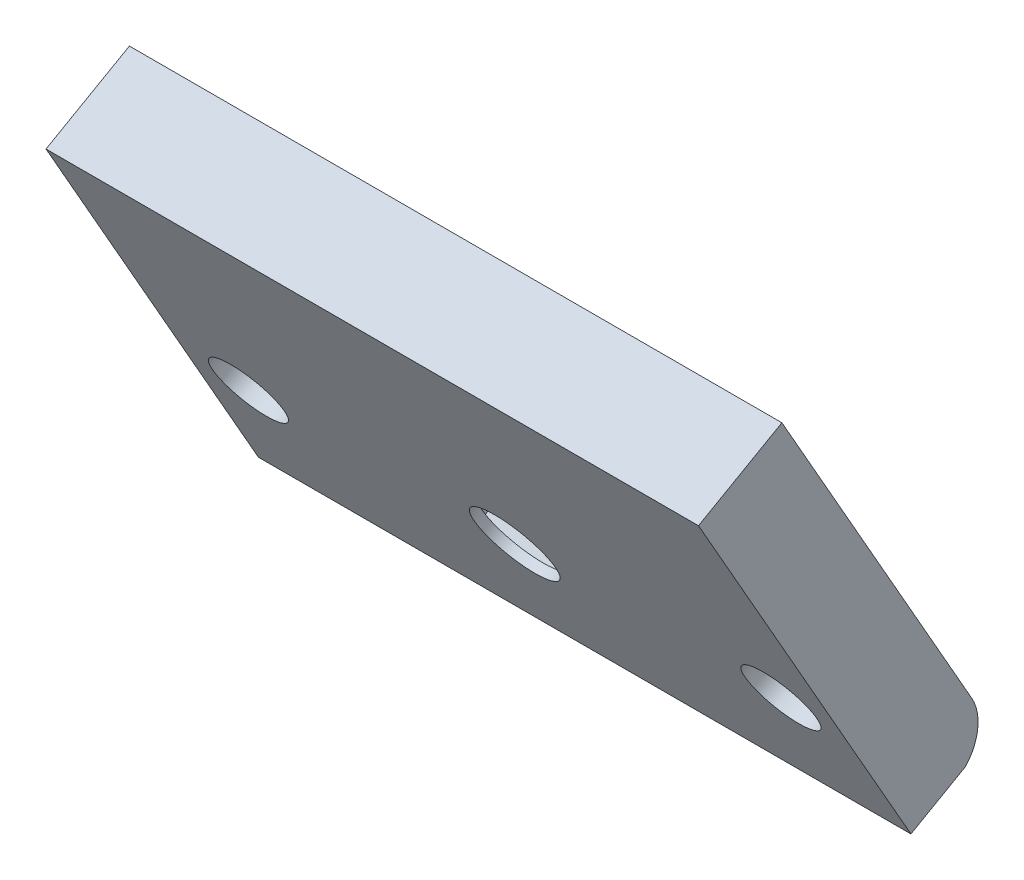
ISO-10303-21;
HEADER;
FILE_DESCRIPTION(('STEP AP214'),'2;1');
FILE_NAME('part.step','',(''),(''),'','','');
FILE_SCHEMA(('AUTOMOTIVE_DESIGN { 1 0 10303 214 1 1 1 1 }'));
ENDSEC;
DATA;
#1=APPLICATION_CONTEXT('core data for automotive mechanical design processes');
#2=APPLICATION_PROTOCOL_DEFINITION('international standard','automotive_design',2000,#1);
#3=PRODUCT_CONTEXT('',#1,'mechanical');
#4=PRODUCT('Part','Part','',(#3));
#5=PRODUCT_RELATED_PRODUCT_CATEGORY('part','',(#4));
#6=PRODUCT_DEFINITION_FORMATION('','',#4);
#7=PRODUCT_DEFINITION_CONTEXT('part definition',#1,'design');
#8=PRODUCT_DEFINITION('design','',#6,#7);
#9=PRODUCT_DEFINITION_SHAPE('','',#8);
#10=(LENGTH_UNIT() NAMED_UNIT(*) SI_UNIT(.MILLI.,.METRE.));
#11=(NAMED_UNIT(*) PLANE_ANGLE_UNIT() SI_UNIT($,.RADIAN.));
#12=(NAMED_UNIT(*) SI_UNIT($,.STERADIAN.) SOLID_ANGLE_UNIT());
#13=UNCERTAINTY_MEASURE_WITH_UNIT(LENGTH_MEASURE(1.E-05),#10,'distance_accuracy_value','');
#14=(GEOMETRIC_REPRESENTATION_CONTEXT(3) GLOBAL_UNCERTAINTY_ASSIGNED_CONTEXT((#13)) GLOBAL_UNIT_ASSIGNED_CONTEXT((#10,
#11,#12)) REPRESENTATION_CONTEXT('',''));
#15=CARTESIAN_POINT('',(0.,0.,0.));
#16=DIRECTION('',(0.,0.,1.));
#17=DIRECTION('',(1.,0.,0.));
#18=AXIS2_PLACEMENT_3D('',#15,#16,#17);
#19=CARTESIAN_POINT('',(-33.9999999999999,129.815203137695,46.6646590965853));
#20=DIRECTION('',(0.,-0.494736971942379,0.869042765687216));
#21=DIRECTION('',(0.,-0.869042765687216,-0.494736971942379));
#22=AXIS2_PLACEMENT_3D('',#19,#20,#21);
#23=PLANE('',#22);
#24=CARTESIAN_POINT('',(0.,57.0490695041152,5.23965904452953));
#25=DIRECTION('',(0.,-0.494736971942379,0.869042765687216));
#26=DIRECTION('',(0.,-0.869042765687216,-0.494736971942379));
#27=AXIS2_PLACEMENT_3D('',#24,#25,#26);
#28=CIRCLE('',#27,4.25);
#29=CARTESIAN_POINT('',(0.,53.3556377499445,3.13702691377442));
#30=VERTEX_POINT('',#29);
#31=EDGE_CURVE('E179',#30,#30,#28,.F.);
#32=ORIENTED_EDGE('',*,*,#31,.F.);
#33=EDGE_LOOP('',(#32));
#34=FACE_BOUND('',#33,.T.);
#35=CARTESIAN_POINT('',(-27.75,57.0490695041152,5.23965904452955));
#36=DIRECTION('',(0.,-0.494736971942379,0.869042765687216));
#37=DIRECTION('',(0.,-0.869042765687216,-0.494736971942379));
#38=AXIS2_PLACEMENT_3D('',#35,#36,#37);
#39=CIRCLE('',#38,3.75000000000001);
#40=CARTESIAN_POINT('',(-27.75,53.7901591327882,3.38439539974563));
#41=VERTEX_POINT('',#40);
#42=EDGE_CURVE('E178',#41,#41,#39,.T.);
#43=ORIENTED_EDGE('',*,*,#42,.T.);
#44=EDGE_LOOP('',(#43));
#45=FACE_BOUND('',#44,.T.);
#46=CARTESIAN_POINT('',(27.75,57.0490695041153,5.23965904452958));
#47=DIRECTION('',(0.,-0.494736971942379,0.869042765687216));
#48=DIRECTION('',(0.,-0.869042765687216,-0.494736971942379));
#49=AXIS2_PLACEMENT_3D('',#46,#47,#48);
#50=CIRCLE('',#49,3.75000000000001);
#51=CARTESIAN_POINT('',(27.75,53.7901591327882,3.38439539974566));
#52=VERTEX_POINT('',#51);
#53=EDGE_CURVE('E174',#52,#52,#50,.T.);
#54=ORIENTED_EDGE('',*,*,#53,.T.);
#55=EDGE_LOOP('',(#54));
#56=FACE_BOUND('',#55,.T.);
#57=CARTESIAN_POINT('',(17.5,48.358641847243,0.292289325105733));
#58=CARTESIAN_POINT('',(17.4972783447475,48.3552968996487,0.290385081368294));
#59=CARTESIAN_POINT('',(17.4945566894576,48.3519519524825,0.288480837874573));
#60=CARTESIAN_POINT('',(17.2482797809468,48.0492765152582,0.116170872006276));
#61=CARTESIAN_POINT('',(17.0046375412352,47.7500030570262,-0.0542023827452684));
#62=CARTESIAN_POINT('',(16.501529448405,47.1610094459144,-0.389510295267227));
#63=CARTESIAN_POINT('',(16.2420552930662,46.871294430298,-0.554442028447173));
#64=CARTESIAN_POINT('',(15.8322203237664,46.4531510742017,-0.792486674810817));
#65=CARTESIAN_POINT('',(15.6925711393815,46.3168500769668,-0.870081409278725));
#66=CARTESIAN_POINT('',(15.4050861749062,46.0509617602916,-1.02144885155031));
#67=CARTESIAN_POINT('',(15.2572527389976,45.9213725387982,-1.09522264217307));
#68=CARTESIAN_POINT('',(14.9527456048189,45.6706985182819,-1.23792874450946));
#69=CARTESIAN_POINT('',(14.7960869769176,45.5495999692563,-1.30686888395606));
#70=CARTESIAN_POINT('',(14.4732920928158,45.3174148596934,-1.43904944234827));
#71=CARTESIAN_POINT('',(14.3071601698682,45.2063237806089,-1.50229243365567));
#72=CARTESIAN_POINT('',(13.9951397677771,45.0142039942232,-1.61166422192607));
#73=CARTESIAN_POINT('',(13.8507717793648,44.9313108204535,-1.65885444018082));
#74=CARTESIAN_POINT('',(13.5557055117445,44.7744796910013,-1.74813676454391));
#75=CARTESIAN_POINT('',(13.4050072086434,44.7005417691234,-1.79022885140762));
#76=CARTESIAN_POINT('',(13.0974326961294,44.562470800823,-1.868831211921));
#77=CARTESIAN_POINT('',(12.9405464270314,44.4983546235233,-1.90533188215524));
#78=CARTESIAN_POINT('',(12.6214595559997,44.3810019766351,-1.97213951862982));
#79=CARTESIAN_POINT('',(12.4592590268308,44.3277653581519,-2.00244656963435));
#80=CARTESIAN_POINT('',(12.129336843026,44.2327309764043,-2.05654865081223));
#81=CARTESIAN_POINT('',(11.9615870317053,44.1910067356895,-2.0803018253657));
#82=CARTESIAN_POINT('',(11.6225676690071,44.1202187450019,-2.12060068929444));
#83=CARTESIAN_POINT('',(11.451298052196,44.0911552306169,-2.13714624455197));
#84=CARTESIAN_POINT('',(11.106681542022,44.0463818353764,-2.16263527093764));
#85=CARTESIAN_POINT('',(10.9333377018539,44.0306543113612,-2.17158878613232));
#86=CARTESIAN_POINT('',(10.5857260212049,44.0130124621464,-2.18163210667377));
#87=CARTESIAN_POINT('',(10.4114582899538,44.0110965389334,-2.1827228217528));
#88=CARTESIAN_POINT('',(10.0713890449694,44.0212064268466,-2.1769673681315));
#89=CARTESIAN_POINT('',(9.9055628061606,44.0326023960148,-2.17047976188101));
#90=CARTESIAN_POINT('',(9.57580640255127,44.0684833885293,-2.15005308751258));
#91=CARTESIAN_POINT('',(9.41187600482867,44.0929667861265,-2.13611494491665));
#92=CARTESIAN_POINT('',(9.08642489886856,44.1552332217919,-2.10066731327983));
#93=CARTESIAN_POINT('',(8.92492271282494,44.193089623232,-2.07911605923733));
#94=CARTESIAN_POINT('',(8.60668414699584,44.2819374466473,-2.0285359211179));
#95=CARTESIAN_POINT('',(8.44995037749486,44.3329359230733,-1.99950302101579));
#96=CARTESIAN_POINT('',(8.29639623176819,44.3904157879339,-1.96678033415663));
#97=B_SPLINE_CURVE_WITH_KNOTS('',3,(#57,#58,#59,#60,#61,#62,#63,#64,#65,#66,#67,#68,#69,#70,#71,
#72,#73,#74,#75,#76,#77,#78,#79,#80,#81,#82,#83,#84,#85,#86,#87,#88,#89,#90,#91,#92,#93,#94,#95,
#96),.UNSPECIFIED.,.F.,.F.,(4,2,2,2,2,2,2,2,2,2,2,2,2,2,2,2,2,2,2,4),(0.,0.0141421356237371,
1.27968723730022,2.54590178874079,3.17565790924472,3.80523457524021,4.43376694260518,
5.06201407910895,5.58072849719426,6.09944487328203,6.61904240458121,7.13863282433377,
7.66146854427636,8.1843139926111,8.70646664631714,9.22855888557431,9.72691642543553,
10.2252120726089,10.7262849084398,11.2276272742767),.UNSPECIFIED.);
#98=CARTESIAN_POINT('',(17.5,48.358641847243,0.2922893251057));
#99=VERTEX_POINT('',#98);
#100=CARTESIAN_POINT('',(12.1130938836837,44.2306887102288,-2.05771129162056));
#101=VERTEX_POINT('',#100);
#102=EDGE_CURVE('E229',#99,#101,#97,.T.);
#103=ORIENTED_EDGE('',*,*,#102,.T.);
#104=DIRECTION('',(-1.,0.,0.));
#105=VECTOR('',#104,1.);
#106=CARTESIAN_POINT('',(-33.9999999999999,44.2306887102287,-2.05771129162057));
#107=LINE('',#106,#105);
#108=CARTESIAN_POINT('',(-12.1130938836837,44.2306887102287,-2.05771129162057));
#109=VERTEX_POINT('',#108);
#110=EDGE_CURVE('E154',#101,#109,#107,.T.);
#111=ORIENTED_EDGE('',*,*,#110,.T.);
#112=CARTESIAN_POINT('',(-17.5,48.358641847243,0.292289325105741));
#113=CARTESIAN_POINT('',(-17.4972783447492,48.3552968996477,0.290385081367716));
#114=CARTESIAN_POINT('',(-17.4945566894609,48.3519519524804,0.28848083787342));
#115=CARTESIAN_POINT('',(-17.2482797811133,48.0492765151861,0.116170871965661));
#116=CARTESIAN_POINT('',(-17.0046375413075,47.7500030570426,-0.0542023827358426));
#117=CARTESIAN_POINT('',(-16.5015294484333,47.1610094460159,-0.389510295209537));
#118=CARTESIAN_POINT('',(-16.2420552931447,46.8712944303962,-0.554442028391253));
#119=CARTESIAN_POINT('',(-15.832220323883,46.4531510743116,-0.792486674748238));
#120=CARTESIAN_POINT('',(-15.6925711395027,46.3168500770816,-0.870081409213301));
#121=CARTESIAN_POINT('',(-15.4050861750407,46.0509617604132,-1.02144885148109));
#122=CARTESIAN_POINT('',(-15.2572527391406,45.9213725389215,-1.09522264210288));
#123=CARTESIAN_POINT('',(-14.9527456049808,45.6706985184096,-1.23792874443674));
#124=CARTESIAN_POINT('',(-14.7960869770901,45.5495999693867,-1.30686888388183));
#125=CARTESIAN_POINT('',(-14.4732920930108,45.3174148598275,-1.43904944227196));
#126=CARTESIAN_POINT('',(-14.3071601700753,45.2063237807439,-1.50229243357878));
#127=CARTESIAN_POINT('',(-13.995139767996,45.0142039943517,-1.61166422185287));
#128=CARTESIAN_POINT('',(-13.8507717795829,44.9313108205755,-1.65885444011138));
#129=CARTESIAN_POINT('',(-13.5557055119598,44.7744796911098,-1.74813676448217));
#130=CARTESIAN_POINT('',(-13.4050072088568,44.700541769225,-1.79022885134981));
#131=CARTESIAN_POINT('',(-13.0974326963416,44.5624708009125,-1.86883121187004));
#132=CARTESIAN_POINT('',(-12.9405464272446,44.4983546236074,-1.90533188210734));
#133=CARTESIAN_POINT('',(-12.6214595562146,44.3810019767084,-1.97213951858808));
#134=CARTESIAN_POINT('',(-12.4592590270465,44.3277653582198,-2.00244656959573));
#135=CARTESIAN_POINT('',(-12.1293368432417,44.2327309764607,-2.05654865078011));
#136=CARTESIAN_POINT('',(-11.9615870319203,44.1910067357401,-2.08030182533692));
#137=CARTESIAN_POINT('',(-11.62256766922,44.1202187450407,-2.12060068927233));
#138=CARTESIAN_POINT('',(-11.4512980524074,44.0911552306499,-2.13714624453317));
#139=CARTESIAN_POINT('',(-11.1066815422282,44.0463818353977,-2.16263527092551));
#140=CARTESIAN_POINT('',(-10.9333377020564,44.0306543113768,-2.17158878612346));
#141=CARTESIAN_POINT('',(-10.5857260213991,44.013012462151,-2.18163210667115));
#142=CARTESIAN_POINT('',(-10.4114582901435,44.0110965389328,-2.18272282175314));
#143=CARTESIAN_POINT('',(-10.0713890451511,44.0212064268364,-2.17696736813729));
#144=CARTESIAN_POINT('',(-9.90556280633862,44.0326023960001,-2.17047976188937));
#145=CARTESIAN_POINT('',(-9.57580640272153,44.0684833885061,-2.15005308752578));
#146=CARTESIAN_POINT('',(-9.41187600499485,44.0929667860993,-2.13611494493214));
#147=CARTESIAN_POINT('',(-9.0864248990283,44.1552332217567,-2.10066731329984));
#148=CARTESIAN_POINT('',(-8.92492271298228,44.1930896231928,-2.07911605925966));
#149=CARTESIAN_POINT('',(-8.60668414714796,44.2819374466001,-2.02853592114474));
#150=CARTESIAN_POINT('',(-8.44995037764417,44.3329359230222,-1.99950302104483));
#151=CARTESIAN_POINT('',(-8.29639623191448,44.3904157878791,-1.96678033418778));
#152=B_SPLINE_CURVE_WITH_KNOTS('',3,(#112,#113,#114,#115,#116,#117,#118,#119,#120,#121,#122,
#123,#124,#125,#126,#127,#128,#129,#130,#131,#132,#133,#134,#135,#136,#137,#138,#139,#140,#141,
#142,#143,#144,#145,#146,#147,#148,#149,#150,#151),.UNSPECIFIED.,.F.,.F.,(4,2,2,2,2,2,2,2,2,2,2,
2,2,2,2,2,2,2,2,4),(0.,0.0141421356237378,1.2796872372145,2.54590178857722,3.1756579090579,
3.80523457503174,4.43376694236693,5.06201407884021,5.58072849694005,6.0994448730447,
6.61904240434918,7.13863282410621,7.66146854405651,8.18431399239926,8.70646664611873,
9.22855888538931,9.72691642526022,10.2252120724433,10.7262849082774,11.2276272741176),.UNSPECIFIED.);
#153=CARTESIAN_POINT('',(-17.5,48.358641847243,0.292289325105752));
#154=VERTEX_POINT('',#153);
#155=EDGE_CURVE('E259',#109,#154,#152,.F.);
#156=ORIENTED_EDGE('',*,*,#155,.T.);
#157=DIRECTION('',(-1.,0.,0.));
#158=VECTOR('',#157,1.);
#159=CARTESIAN_POINT('',(-33.9999999999999,48.358641847243,0.292289325105728));
#160=LINE('',#159,#158);
#161=CARTESIAN_POINT('',(-33.9999999999999,48.358641847243,0.292289325105742));
#162=VERTEX_POINT('',#161);
#163=EDGE_CURVE('E322',#154,#162,#160,.T.);
#164=ORIENTED_EDGE('',*,*,#163,.T.);
#165=DIRECTION('',(0.,-0.869042765687216,-0.494736971942379));
#166=VECTOR('',#165,1.);
#167=CARTESIAN_POINT('',(-33.9999999999999,129.815203137695,46.6646590965853));
#168=LINE('',#167,#166);
#169=CARTESIAN_POINT('',(-33.9999999999999,83.1203524747318,20.081768202801));
#170=VERTEX_POINT('',#169);
#171=EDGE_CURVE('E168',#170,#162,#168,.T.);
#172=ORIENTED_EDGE('',*,*,#171,.F.);
#173=DIRECTION('',(-1.,0.,0.));
#174=VECTOR('',#173,1.);
#175=CARTESIAN_POINT('',(-33.9999999999999,83.1203524747318,20.081768202801));
#176=LINE('',#175,#174);
#177=CARTESIAN_POINT('',(34.,83.1203524747318,20.081768202801));
#178=VERTEX_POINT('',#177);
#179=EDGE_CURVE('E171',#178,#170,#176,.T.);
#180=ORIENTED_EDGE('',*,*,#179,.F.);
#181=DIRECTION('',(0.,-0.869042765687216,-0.494736971942379));
#182=VECTOR('',#181,1.);
#183=CARTESIAN_POINT('',(34.,129.815203137695,46.6646590965853));
#184=LINE('',#183,#182);
#185=CARTESIAN_POINT('',(34.,48.358641847243,0.292289325105742));
#186=VERTEX_POINT('',#185);
#187=EDGE_CURVE('E310',#178,#186,#184,.T.);
#188=ORIENTED_EDGE('',*,*,#187,.T.);
#189=DIRECTION('',(-1.,0.,0.));
#190=VECTOR('',#189,1.);
#191=CARTESIAN_POINT('',(-33.9999999999999,48.358641847243,0.292289325105728));
#192=LINE('',#191,#190);
#193=EDGE_CURVE('E159',#186,#99,#192,.T.);
#194=ORIENTED_EDGE('',*,*,#193,.T.);
#195=EDGE_LOOP('',(#103,#111,#156,#164,#172,#180,#188,#194));
#196=FACE_BOUND('',#195,.T.);
#197=ADVANCED_FACE('F45',(#34,#45,#56,#196),#23,.F.);
#198=CARTESIAN_POINT('',(34.,129.815203137695,46.6646590965853));
#199=DIRECTION('',(-1.,0.,0.));
#200=DIRECTION('',(0.,0.,1.));
#201=AXIS2_PLACEMENT_3D('',#198,#199,#200);
#202=PLANE('',#201);
#203=DIRECTION('',(0.,-0.869042765687216,-0.494736971942379));
#204=VECTOR('',#203,1.);
#205=CARTESIAN_POINT('',(34.,124.867833418271,55.3550867534574));
#206=LINE('',#205,#204);
#207=CARTESIAN_POINT('',(34.,78.172982755308,28.7721958596732));
#208=VERTEX_POINT('',#207);
#209=CARTESIAN_POINT('',(34.,39.283318990805,6.63271636525159));
#210=VERTEX_POINT('',#209);
#211=EDGE_CURVE('E153',#208,#210,#206,.T.);
#212=ORIENTED_EDGE('',*,*,#211,.T.);
#213=DIRECTION('',(0.,0.494736971942379,-0.869042765687216));
#214=VECTOR('',#213,1.);
#215=CARTESIAN_POINT('',(34.,44.2306887102288,-2.05771129162057));
#216=LINE('',#215,#214);
#217=CARTESIAN_POINT('',(34.,42.5294117003954,0.930709953755657));
#218=VERTEX_POINT('',#217);
#219=EDGE_CURVE('E146',#210,#218,#216,.T.);
#220=ORIENTED_EDGE('',*,*,#219,.T.);
#221=CARTESIAN_POINT('',(34.,45.8849569875311,4.63750315354181));
#222=DIRECTION('',(-1.,0.,0.));
#223=DIRECTION('',(0.,0.,1.));
#224=AXIS2_PLACEMENT_3D('',#221,#222,#223);
#225=CIRCLE('',#224,5.);
#226=EDGE_CURVE('E55',#218,#186,#225,.F.);
#227=ORIENTED_EDGE('',*,*,#226,.T.);
#228=ORIENTED_EDGE('',*,*,#187,.F.);
#229=DIRECTION('',(0.,0.49473697194238,-0.869042765687216));
#230=VECTOR('',#229,1.);
#231=CARTESIAN_POINT('',(34.,83.1203524747318,20.081768202801));
#232=LINE('',#231,#230);
#233=EDGE_CURVE('E336',#208,#178,#232,.T.);
#234=ORIENTED_EDGE('',*,*,#233,.F.);
#235=EDGE_LOOP('',(#212,#220,#227,#228,#234));
#236=FACE_BOUND('',#235,.T.);
#237=ADVANCED_FACE('F151',(#236),#202,.F.);
#238=CARTESIAN_POINT('',(-33.9999999999999,124.867833418271,55.3550867534574));
#239=DIRECTION('',(0.,0.494736971942379,-0.869042765687216));
#240=DIRECTION('',(0.,0.869042765687216,0.494736971942379));
#241=AXIS2_PLACEMENT_3D('',#238,#239,#240);
#242=PLANE('',#241);
#243=CARTESIAN_POINT('',(0.,52.1016997846914,13.9300867014017));
#244=DIRECTION('',(0.,0.494736971942379,-0.869042765687216));
#245=DIRECTION('',(0.,0.869042765687216,0.494736971942379));
#246=AXIS2_PLACEMENT_3D('',#243,#244,#245);
#247=CIRCLE('',#246,4.25);
#248=CARTESIAN_POINT('',(0.,48.4082680305207,11.8274545706466));
#249=VERTEX_POINT('',#248);
#250=EDGE_CURVE('E185',#249,#249,#247,.F.);
#251=ORIENTED_EDGE('',*,*,#250,.F.);
#252=EDGE_LOOP('',(#251));
#253=FACE_BOUND('',#252,.T.);
#254=CARTESIAN_POINT('',(-27.75,52.1016997846914,13.9300867014017));
#255=DIRECTION('',(0.,0.494736971942379,-0.869042765687216));
#256=DIRECTION('',(0.,0.869042765687216,0.494736971942379));
#257=AXIS2_PLACEMENT_3D('',#254,#255,#256);
#258=CIRCLE('',#257,3.75000000000001);
#259=CARTESIAN_POINT('',(-27.75,55.3606101560185,15.7853503461856));
#260=VERTEX_POINT('',#259);
#261=EDGE_CURVE('E176',#260,#260,#258,.T.);
#262=ORIENTED_EDGE('',*,*,#261,.T.);
#263=EDGE_LOOP('',(#262));
#264=FACE_BOUND('',#263,.T.);
#265=CARTESIAN_POINT('',(27.75,52.1016997846915,13.9300867014017));
#266=DIRECTION('',(0.,0.494736971942379,-0.869042765687216));
#267=DIRECTION('',(0.,0.869042765687216,0.494736971942379));
#268=AXIS2_PLACEMENT_3D('',#265,#266,#267);
#269=CIRCLE('',#268,3.75000000000001);
#270=CARTESIAN_POINT('',(27.75,55.3606101560185,15.7853503461857));
#271=VERTEX_POINT('',#270);
#272=EDGE_CURVE('E172',#271,#271,#269,.T.);
#273=ORIENTED_EDGE('',*,*,#272,.T.);
#274=EDGE_LOOP('',(#273));
#275=FACE_BOUND('',#274,.T.);
#276=DIRECTION('',(0.,-0.869042765687216,-0.494736971942379));
#277=VECTOR('',#276,1.);
#278=CARTESIAN_POINT('',(-33.9999999999999,124.867833418271,55.3550867534574));
#279=LINE('',#278,#277);
#280=CARTESIAN_POINT('',(-33.9999999999999,78.172982755308,28.7721958596732));
#281=VERTEX_POINT('',#280);
#282=CARTESIAN_POINT('',(-33.9999999999999,39.283318990805,6.63271636525158));
#283=VERTEX_POINT('',#282);
#284=EDGE_CURVE('E314',#281,#283,#279,.T.);
#285=ORIENTED_EDGE('',*,*,#284,.T.);
#286=DIRECTION('',(1.,0.,0.));
#287=VECTOR('',#286,1.);
#288=CARTESIAN_POINT('',(-33.9999999999999,39.283318990805,6.63271636525158));
#289=LINE('',#288,#287);
#290=EDGE_CURVE('E199',#283,#210,#289,.T.);
#291=ORIENTED_EDGE('',*,*,#290,.T.);
#292=ORIENTED_EDGE('',*,*,#211,.F.);
#293=DIRECTION('',(1.,0.,0.));
#294=VECTOR('',#293,1.);
#295=CARTESIAN_POINT('',(-33.9999999999999,78.172982755308,28.7721958596732));
#296=LINE('',#295,#294);
#297=EDGE_CURVE('E334',#281,#208,#296,.T.);
#298=ORIENTED_EDGE('',*,*,#297,.F.);
#299=EDGE_LOOP('',(#285,#291,#292,#298));
#300=FACE_BOUND('',#299,.T.);
#301=ADVANCED_FACE('F282',(#253,#264,#275,#300),#242,.F.);
#302=CARTESIAN_POINT('',(-33.9999999999999,129.815203137695,46.6646590965853));
#303=DIRECTION('',(1.,0.,0.));
#304=DIRECTION('',(0.,0.,-1.));
#305=AXIS2_PLACEMENT_3D('',#302,#303,#304);
#306=PLANE('',#305);
#307=CARTESIAN_POINT('',(-33.9999999999999,45.8849569875311,4.63750315354181));
#308=DIRECTION('',(1.,0.,0.));
#309=DIRECTION('',(0.,0.,-1.));
#310=AXIS2_PLACEMENT_3D('',#307,#308,#309);
#311=CIRCLE('',#310,5.);
#312=CARTESIAN_POINT('',(-33.9999999999999,42.5294117003954,0.930709953755657));
#313=VERTEX_POINT('',#312);
#314=EDGE_CURVE('E161',#162,#313,#311,.F.);
#315=ORIENTED_EDGE('',*,*,#314,.T.);
#316=DIRECTION('',(0.,-0.494736971942379,0.869042765687216));
#317=VECTOR('',#316,1.);
#318=CARTESIAN_POINT('',(-33.9999999999999,44.2306887102288,-2.05771129162056));
#319=LINE('',#318,#317);
#320=EDGE_CURVE('E175',#313,#283,#319,.T.);
#321=ORIENTED_EDGE('',*,*,#320,.T.);
#322=ORIENTED_EDGE('',*,*,#284,.F.);
#323=DIRECTION('',(0.,-0.49473697194238,0.869042765687216));
#324=VECTOR('',#323,1.);
#325=CARTESIAN_POINT('',(-33.9999999999999,83.1203524747318,20.081768202801));
#326=LINE('',#325,#324);
#327=EDGE_CURVE('E330',#170,#281,#326,.T.);
#328=ORIENTED_EDGE('',*,*,#327,.F.);
#329=ORIENTED_EDGE('',*,*,#171,.T.);
#330=EDGE_LOOP('',(#315,#321,#322,#328,#329));
#331=FACE_BOUND('',#330,.T.);
#332=ADVANCED_FACE('F285',(#331),#306,.F.);
#333=CARTESIAN_POINT('',(-17.5,49.595484277099,-1.88031758911231));
#334=DIRECTION('',(0.,0.869042765687216,0.494736971942379));
#335=DIRECTION('',(0.,-0.494736971942379,0.869042765687216));
#336=AXIS2_PLACEMENT_3D('',#333,#334,#335);
#337=TOROIDAL_SURFACE('',#336,7.5,5.);
#338=CARTESIAN_POINT('',(-17.5,45.4675311400847,-4.23031820583861));
#339=DIRECTION('',(0.,-0.869042765687216,-0.494736971942379));
#340=DIRECTION('',(0.,0.494736971942379,-0.869042765687216));
#341=AXIS2_PLACEMENT_3D('',#338,#339,#340);
#342=CIRCLE('',#341,5.93875050040039);
#343=CARTESIAN_POINT('',(-17.5,42.5294117003953,0.930709953755684));
#344=VERTEX_POINT('',#343);
#345=EDGE_CURVE('E197',#344,#109,#342,.F.);
#346=ORIENTED_EDGE('',*,*,#345,.F.);
#347=CARTESIAN_POINT('',(-17.5,45.8849569875311,4.63750315354181));
#348=DIRECTION('',(-1.,0.,0.));
#349=DIRECTION('',(0.,0.,1.));
#350=AXIS2_PLACEMENT_3D('',#347,#348,#349);
#351=CIRCLE('',#350,5.);
#352=EDGE_CURVE('E165',#154,#344,#351,.T.);
#353=ORIENTED_EDGE('',*,*,#352,.F.);
#354=ORIENTED_EDGE('',*,*,#155,.F.);
#355=EDGE_LOOP('',(#346,#353,#354));
#356=FACE_BOUND('',#355,.T.);
#357=ADVANCED_FACE('F289',(#356),#337,.T.);
#358=CARTESIAN_POINT('',(-33.9999999999999,45.8849569875311,4.63750315354181));
#359=DIRECTION('',(-1.,0.,0.));
#360=DIRECTION('',(0.,-1.,0.));
#361=AXIS2_PLACEMENT_3D('',#358,#359,#360);
#362=CYLINDRICAL_SURFACE('',#361,5.);
#363=DIRECTION('',(-1.,0.,0.));
#364=VECTOR('',#363,1.);
#365=CARTESIAN_POINT('',(-33.9999999999999,42.5294117003954,0.930709953755657));
#366=LINE('',#365,#364);
#367=EDGE_CURVE('E201',#313,#344,#366,.F.);
#368=ORIENTED_EDGE('',*,*,#367,.F.);
#369=ORIENTED_EDGE('',*,*,#314,.F.);
#370=ORIENTED_EDGE('',*,*,#163,.F.);
#371=ORIENTED_EDGE('',*,*,#352,.T.);
#372=EDGE_LOOP('',(#368,#369,#370,#371));
#373=FACE_BOUND('',#372,.T.);
#374=ADVANCED_FACE('F291',(#373),#362,.T.);
#375=CARTESIAN_POINT('',(17.5,49.595484277099,-1.88031758911231));
#376=DIRECTION('',(0.,0.869042765687216,0.494736971942379));
#377=DIRECTION('',(0.,-0.494736971942379,0.869042765687216));
#378=AXIS2_PLACEMENT_3D('',#375,#376,#377);
#379=TOROIDAL_SURFACE('',#378,7.5,5.);
#380=CARTESIAN_POINT('',(17.5,45.4675311400847,-4.23031820583861));
#381=DIRECTION('',(0.,-0.869042765687216,-0.494736971942379));
#382=DIRECTION('',(0.,0.494736971942379,-0.869042765687216));
#383=AXIS2_PLACEMENT_3D('',#380,#381,#382);
#384=CIRCLE('',#383,5.93875050040039);
#385=CARTESIAN_POINT('',(17.5,42.5294117003954,0.930709953755661));
#386=VERTEX_POINT('',#385);
#387=EDGE_CURVE('E62',#101,#386,#384,.F.);
#388=ORIENTED_EDGE('',*,*,#387,.F.);
#389=ORIENTED_EDGE('',*,*,#102,.F.);
#390=CARTESIAN_POINT('',(17.5,45.8849569875311,4.63750315354181));
#391=DIRECTION('',(1.,0.,0.));
#392=DIRECTION('',(0.,0.,-1.));
#393=AXIS2_PLACEMENT_3D('',#390,#391,#392);
#394=CIRCLE('',#393,5.);
#395=EDGE_CURVE('E169',#386,#99,#394,.T.);
#396=ORIENTED_EDGE('',*,*,#395,.F.);
#397=EDGE_LOOP('',(#388,#389,#396));
#398=FACE_BOUND('',#397,.T.);
#399=ADVANCED_FACE('F47',(#398),#379,.T.);
#400=CARTESIAN_POINT('',(-33.9999999999999,45.8849569875311,4.63750315354181));
#401=DIRECTION('',(-1.,0.,0.));
#402=DIRECTION('',(0.,-1.,0.));
#403=AXIS2_PLACEMENT_3D('',#400,#401,#402);
#404=CYLINDRICAL_SURFACE('',#403,5.);
#405=DIRECTION('',(-1.,0.,0.));
#406=VECTOR('',#405,1.);
#407=CARTESIAN_POINT('',(-33.9999999999999,42.5294117003954,0.930709953755657));
#408=LINE('',#407,#406);
#409=EDGE_CURVE('E11',#386,#218,#408,.F.);
#410=ORIENTED_EDGE('',*,*,#409,.F.);
#411=ORIENTED_EDGE('',*,*,#395,.T.);
#412=ORIENTED_EDGE('',*,*,#193,.F.);
#413=ORIENTED_EDGE('',*,*,#226,.F.);
#414=EDGE_LOOP('',(#410,#411,#412,#413));
#415=FACE_BOUND('',#414,.T.);
#416=ADVANCED_FACE('F157',(#415),#404,.T.);
#417=CARTESIAN_POINT('',(0.,71.4095344831715,40.6527023213663));
#418=DIRECTION('',(0.,0.869042765687216,0.49473697194238));
#419=DIRECTION('',(0.,-0.49473697194238,0.869042765687216));
#420=AXIS2_PLACEMENT_3D('',#417,#418,#419);
#421=PLANE('',#420);
#422=ORIENTED_EDGE('',*,*,#327,.T.);
#423=ORIENTED_EDGE('',*,*,#297,.T.);
#424=ORIENTED_EDGE('',*,*,#233,.T.);
#425=ORIENTED_EDGE('',*,*,#179,.T.);
#426=EDGE_LOOP('',(#422,#423,#424,#425));
#427=FACE_BOUND('',#426,.T.);
#428=ADVANCED_FACE('F271',(#427),#421,.T.);
#429=CARTESIAN_POINT('',(27.75,70.3681781395573,-18.1563587618393));
#430=DIRECTION('',(0.,-0.494736971942381,0.869042765687215));
#431=DIRECTION('',(0.,-0.869042765687215,-0.494736971942381));
#432=AXIS2_PLACEMENT_3D('',#429,#430,#431);
#433=CYLINDRICAL_SURFACE('',#432,3.75000000000001);
#434=ORIENTED_EDGE('',*,*,#272,.F.);
#435=EDGE_LOOP('',(#434));
#436=FACE_BOUND('',#435,.T.);
#437=ORIENTED_EDGE('',*,*,#53,.F.);
#438=EDGE_LOOP('',(#437));
#439=FACE_BOUND('',#438,.T.);
#440=ADVANCED_FACE('F275',(#436,#439),#433,.F.);
#441=CARTESIAN_POINT('',(-30.,20.2172606914218,40.1236842429856));
#442=DIRECTION('',(0.,0.869042765687216,0.494736971942379));
#443=DIRECTION('',(0.,-0.494736971942379,0.869042765687216));
#444=AXIS2_PLACEMENT_3D('',#441,#442,#443);
#445=PLANE('',#444);
#446=ORIENTED_EDGE('',*,*,#367,.T.);
#447=ORIENTED_EDGE('',*,*,#345,.T.);
#448=ORIENTED_EDGE('',*,*,#110,.F.);
#449=ORIENTED_EDGE('',*,*,#387,.T.);
#450=ORIENTED_EDGE('',*,*,#409,.T.);
#451=ORIENTED_EDGE('',*,*,#219,.F.);
#452=ORIENTED_EDGE('',*,*,#290,.F.);
#453=ORIENTED_EDGE('',*,*,#320,.F.);
#454=EDGE_LOOP('',(#446,#447,#448,#449,#450,#451,#452,#453));
#455=FACE_BOUND('',#454,.T.);
#456=ADVANCED_FACE('F145',(#455),#445,.F.);
#457=CARTESIAN_POINT('',(-27.75,70.3681781395572,-18.1563587618392));
#458=DIRECTION('',(0.,-0.494736971942381,0.869042765687215));
#459=DIRECTION('',(0.,-0.869042765687215,-0.494736971942381));
#460=AXIS2_PLACEMENT_3D('',#457,#458,#459);
#461=CYLINDRICAL_SURFACE('',#460,3.75000000000001);
#462=ORIENTED_EDGE('',*,*,#261,.F.);
#463=EDGE_LOOP('',(#462));
#464=FACE_BOUND('',#463,.T.);
#465=ORIENTED_EDGE('',*,*,#42,.F.);
#466=EDGE_LOOP('',(#465));
#467=FACE_BOUND('',#466,.T.);
#468=ADVANCED_FACE('F413',(#464,#467),#461,.F.);
#469=CARTESIAN_POINT('',(0.,92.0756577668826,-56.2871822120563));
#470=DIRECTION('',(0.,-0.49473697194238,0.869042765687215));
#471=DIRECTION('',(0.,-0.869042765687215,-0.49473697194238));
#472=AXIS2_PLACEMENT_3D('',#469,#470,#471);
#473=CYLINDRICAL_SURFACE('',#472,4.25);
#474=CARTESIAN_POINT('',(0.,56.5543325321728,6.10870181021676));
#475=DIRECTION('',(0.,-0.494736971942379,0.869042765687216));
#476=DIRECTION('',(0.,-0.869042765687216,-0.494736971942379));
#477=AXIS2_PLACEMENT_3D('',#474,#475,#476);
#478=CIRCLE('',#477,4.25);
#479=CARTESIAN_POINT('',(0.,52.8609007780021,4.00606967946166));
#480=VERTEX_POINT('',#479);
#481=EDGE_CURVE('E50',#480,#480,#478,.F.);
#482=CARTESIAN_POINT('',(0.,52.8609007780021,4.00606967946166));
#483=CARTESIAN_POINT('',(0.,52.8660542881265,3.99701715065242));
#484=CARTESIAN_POINT('',(0.,52.8712077982509,3.98796462184318));
#485=CARTESIAN_POINT('',(0.,52.8815148184997,3.96985956422469));
#486=CARTESIAN_POINT('',(0.,52.8866683286241,3.96080703541544));
#487=CARTESIAN_POINT('',(0.,52.8969753488729,3.94270197779696));
#488=CARTESIAN_POINT('',(0.,52.9021288589973,3.93364944898772));
#489=CARTESIAN_POINT('',(0.,52.9124358792461,3.91554439136924));
#490=CARTESIAN_POINT('',(0.,52.9175893893705,3.90649186255999));
#491=CARTESIAN_POINT('',(0.,52.9278964096193,3.88838680494151));
#492=CARTESIAN_POINT('',(0.,52.9330499197437,3.87933427613226));
#493=CARTESIAN_POINT('',(0.,52.9433569399925,3.86122921851378));
#494=CARTESIAN_POINT('',(0.,52.9485104501169,3.85217668970454));
#495=CARTESIAN_POINT('',(0.,52.9588174703657,3.83407163208605));
#496=CARTESIAN_POINT('',(0.,52.9639709804901,3.82501910327681));
#497=CARTESIAN_POINT('',(0.,52.9742780007389,3.80691404565833));
#498=CARTESIAN_POINT('',(0.,52.9794315108633,3.79786151684909));
#499=CARTESIAN_POINT('',(0.,52.9897385311121,3.7797564592306));
#500=CARTESIAN_POINT('',(0.,52.9948920412365,3.77070393042136));
#501=CARTESIAN_POINT('',(0.,53.0051990614853,3.75259887280288));
#502=CARTESIAN_POINT('',(0.,53.0103525716097,3.74354634399364));
#503=CARTESIAN_POINT('',(0.,53.0206595918585,3.72544128637516));
#504=CARTESIAN_POINT('',(0.,53.0258131019829,3.71638875756591));
#505=CARTESIAN_POINT('',(0.,53.0361201222317,3.69828369994743));
#506=CARTESIAN_POINT('',(0.,53.0412736323561,3.68923117113818));
#507=CARTESIAN_POINT('',(0.,53.0515806526049,3.6711261135197));
#508=CARTESIAN_POINT('',(0.,53.0567341627293,3.66207358471046));
#509=CARTESIAN_POINT('',(0.,53.0670411829781,3.64396852709197));
#510=CARTESIAN_POINT('',(0.,53.0721946931025,3.63491599828274));
#511=CARTESIAN_POINT('',(0.,53.0825017133513,3.61681094066425));
#512=CARTESIAN_POINT('',(0.,53.0876552234757,3.607758411855));
#513=CARTESIAN_POINT('',(0.,53.0979622437245,3.58965335423651));
#514=CARTESIAN_POINT('',(0.,53.1031157538489,3.58060082542728));
#515=CARTESIAN_POINT('',(0.,53.1134227740977,3.56249576780879));
#516=CARTESIAN_POINT('',(0.,53.1185762842221,3.55344323899955));
#517=CARTESIAN_POINT('',(0.,53.1288833044709,3.53533818138107));
#518=CARTESIAN_POINT('',(0.,53.1340368145953,3.52628565257182));
#519=CARTESIAN_POINT('',(0.,53.1443438348441,3.50818059495334));
#520=CARTESIAN_POINT('',(0.,53.1494973449685,3.49912806614409));
#521=CARTESIAN_POINT('',(0.,53.1598043652173,3.48102300852561));
#522=CARTESIAN_POINT('',(0.,53.1649578753417,3.47197047971637));
#523=CARTESIAN_POINT('',(0.,53.1752648955905,3.45386542209789));
#524=CARTESIAN_POINT('',(0.,53.1804184057149,3.44481289328865));
#525=CARTESIAN_POINT('',(0.,53.1907254259637,3.42670783567016));
#526=CARTESIAN_POINT('',(0.,53.1958789360881,3.41765530686092));
#527=CARTESIAN_POINT('',(0.,53.2061859563369,3.39955024924243));
#528=CARTESIAN_POINT('',(0.,53.2113394664613,3.3904977204332));
#529=CARTESIAN_POINT('',(0.,53.2216464867101,3.37239266281471));
#530=CARTESIAN_POINT('',(0.,53.2267999968345,3.36334013400546));
#531=CARTESIAN_POINT('',(0.,53.2371070170833,3.34523507638698));
#532=CARTESIAN_POINT('',(0.,53.2422605272077,3.33618254757774));
#533=CARTESIAN_POINT('',(0.,53.2525675474565,3.31807748995926));
#534=CARTESIAN_POINT('',(0.,53.2577210575809,3.30902496115001));
#535=CARTESIAN_POINT('',(0.,53.2680280778297,3.29091990353153));
#536=CARTESIAN_POINT('',(0.,53.2731815879541,3.28186737472229));
#537=CARTESIAN_POINT('',(0.,53.2834886082029,3.26376231710381));
#538=CARTESIAN_POINT('',(0.,53.2886421183273,3.25470978829456));
#539=CARTESIAN_POINT('',(0.,53.2989491385761,3.23660473067607));
#540=CARTESIAN_POINT('',(0.,53.3041026487005,3.22755220186683));
#541=CARTESIAN_POINT('',(0.,53.3144096689493,3.20944714424835));
#542=CARTESIAN_POINT('',(0.,53.3195631790737,3.20039461543911));
#543=CARTESIAN_POINT('',(0.,53.3298701993225,3.18228955782063));
#544=CARTESIAN_POINT('',(0.,53.3350237094469,3.17323702901138));
#545=CARTESIAN_POINT('',(0.,53.3453307296957,3.1551319713929));
#546=CARTESIAN_POINT('',(0.,53.3504842398201,3.14607944258366));
#547=CARTESIAN_POINT('',(0.,53.3556377499445,3.13702691377442));
#548=B_SPLINE_CURVE_WITH_KNOTS('',3,(#482,#483,#484,#485,#486,#487,#488,#489,#490,#491,#492,
#493,#494,#495,#496,#497,#498,#499,#500,#501,#502,#503,#504,#505,#506,#507,#508,#509,#510,#511,
#512,#513,#514,#515,#516,#517,#518,#519,#520,#521,#522,#523,#524,#525,#526,#527,#528,#529,#530,
#531,#532,#533,#534,#535,#536,#537,#538,#539,#540,#541,#542,#543,#544,#545,#546,#547),
.UNSPECIFIED.,.F.,.F.,(4,2,2,2,2,2,2,2,2,2,2,2,2,2,2,2,2,2,2,2,2,2,2,2,2,2,2,2,2,2,2,2,4),(0.,
0.0312499999999938,0.0625000000000091,0.0937500000000028,0.125000000000003,0.156250000000012,
0.187500000000012,0.218750000000002,0.250000000000002,0.281250000000011,0.312500000000005,
0.343750000000005,0.375000000000014,0.406250000000014,0.437500000000008,0.46875000000002,
0.500000000000013,0.531250000000013,0.562500000000022,0.593750000000022,0.625000000000016,
0.656250000000025,0.687500000000022,0.718750000000015,0.750000000000031,0.781250000000024,
0.812500000000024,0.843750000000018,0.875000000000033,0.906250000000024,0.937500000000023,
0.968750000000033,1.00000000000003),.UNSPECIFIED.);
#549=EDGE_CURVE('BSEAM426',#480,#30,#548,.T.);
#550=ORIENTED_EDGE('',*,*,#481,.F.);
#551=ORIENTED_EDGE('',*,*,#31,.T.);
#552=ORIENTED_EDGE('',*,*,#549,.T.);
#553=ORIENTED_EDGE('',*,*,#549,.F.);
#554=EDGE_LOOP('',(#550,#552,#551,#553));
#555=FACE_BOUND('',#554,.T.);
#556=ADVANCED_FACE('F426',(#555),#473,.F.);
#557=CARTESIAN_POINT('',(0.,52.5964367566338,13.0610439357145));
#558=DIRECTION('',(0.,-0.494736971942379,0.869042765687216));
#559=DIRECTION('',(0.,-0.869042765687216,-0.494736971942379));
#560=AXIS2_PLACEMENT_3D('',#557,#558,#559);
#561=CIRCLE('',#560,4.25);
#562=CARTESIAN_POINT('',(0.,48.9030050024631,10.9584118049594));
#563=VERTEX_POINT('',#562);
#564=EDGE_CURVE('E190',#563,#563,#561,.F.);
#565=CARTESIAN_POINT('',(0.,48.9030050024631,10.9584118049594));
#566=CARTESIAN_POINT('',(0.,48.8978514923387,10.9674643337686));
#567=CARTESIAN_POINT('',(0.,48.8926979822143,10.9765168625779));
#568=CARTESIAN_POINT('',(0.,48.8823909619655,10.9946219201964));
#569=CARTESIAN_POINT('',(0.,48.8772374518411,11.0036744490056));
#570=CARTESIAN_POINT('',(0.,48.8669304315923,11.0217795066241));
#571=CARTESIAN_POINT('',(0.,48.8617769214679,11.0308320354333));
#572=CARTESIAN_POINT('',(0.,48.8514699012191,11.0489370930518));
#573=CARTESIAN_POINT('',(0.,48.8463163910947,11.057989621861));
#574=CARTESIAN_POINT('',(0.,48.8360093708459,11.0760946794795));
#575=CARTESIAN_POINT('',(0.,48.8308558607215,11.0851472082888));
#576=CARTESIAN_POINT('',(0.,48.8205488404727,11.1032522659073));
#577=CARTESIAN_POINT('',(0.,48.8153953303483,11.1123047947165));
#578=CARTESIAN_POINT('',(0.,48.8050883100995,11.130409852335));
#579=CARTESIAN_POINT('',(0.,48.7999347999751,11.1394623811442));
#580=CARTESIAN_POINT('',(0.,48.7896277797263,11.1575674387627));
#581=CARTESIAN_POINT('',(0.,48.7844742696019,11.1666199675719));
#582=CARTESIAN_POINT('',(0.,48.7741672493531,11.1847250251904));
#583=CARTESIAN_POINT('',(0.,48.7690137392287,11.1937775539997));
#584=CARTESIAN_POINT('',(0.,48.7587067189799,11.2118826116182));
#585=CARTESIAN_POINT('',(0.,48.7535532088555,11.2209351404274));
#586=CARTESIAN_POINT('',(0.,48.7432461886067,11.2390401980459));
#587=CARTESIAN_POINT('',(0.,48.7380926784823,11.2480927268551));
#588=CARTESIAN_POINT('',(0.,48.7277856582335,11.2661977844736));
#589=CARTESIAN_POINT('',(0.,48.7226321481091,11.2752503132828));
#590=CARTESIAN_POINT('',(0.,48.7123251278603,11.2933553709013));
#591=CARTESIAN_POINT('',(0.,48.7071716177359,11.3024078997106));
#592=CARTESIAN_POINT('',(0.,48.6968645974871,11.320512957329));
#593=CARTESIAN_POINT('',(0.,48.6917110873627,11.3295654861383));
#594=CARTESIAN_POINT('',(0.,48.6814040671139,11.3476705437568));
#595=CARTESIAN_POINT('',(0.,48.6762505569895,11.356723072566));
#596=CARTESIAN_POINT('',(0.,48.6659435367407,11.3748281301845));
#597=CARTESIAN_POINT('',(0.,48.6607900266163,11.3838806589937));
#598=CARTESIAN_POINT('',(0.,48.6504830063675,11.4019857166122));
#599=CARTESIAN_POINT('',(0.,48.6453294962431,11.4110382454215));
#600=CARTESIAN_POINT('',(0.,48.6350224759943,11.4291433030399));
#601=CARTESIAN_POINT('',(0.,48.6298689658699,11.4381958318492));
#602=CARTESIAN_POINT('',(0.,48.6195619456211,11.4563008894677));
#603=CARTESIAN_POINT('',(0.,48.6144084354967,11.4653534182769));
#604=CARTESIAN_POINT('',(0.,48.6041014152479,11.4834584758954));
#605=CARTESIAN_POINT('',(0.,48.5989479051235,11.4925110047046));
#606=CARTESIAN_POINT('',(0.,48.5886408848747,11.5106160623231));
#607=CARTESIAN_POINT('',(0.,48.5834873747503,11.5196685911324));
#608=CARTESIAN_POINT('',(0.,48.5731803545015,11.5377736487508));
#609=CARTESIAN_POINT('',(0.,48.5680268443771,11.5468261775601));
#610=CARTESIAN_POINT('',(0.,48.5577198241283,11.5649312351786));
#611=CARTESIAN_POINT('',(0.,48.5525663140039,11.5739837639878));
#612=CARTESIAN_POINT('',(0.,48.5422592937551,11.5920888216063));
#613=CARTESIAN_POINT('',(0.,48.5371057836307,11.6011413504155));
#614=CARTESIAN_POINT('',(0.,48.5267987633819,11.619246408034));
#615=CARTESIAN_POINT('',(0.,48.5216452532575,11.6282989368433));
#616=CARTESIAN_POINT('',(0.,48.5113382330087,11.6464039944618));
#617=CARTESIAN_POINT('',(0.,48.5061847228843,11.655456523271));
#618=CARTESIAN_POINT('',(0.,48.4958777026355,11.6735615808895));
#619=CARTESIAN_POINT('',(0.,48.4907241925111,11.6826141096987));
#620=CARTESIAN_POINT('',(0.,48.4804171722623,11.7007191673172));
#621=CARTESIAN_POINT('',(0.,48.4752636621379,11.7097716961264));
#622=CARTESIAN_POINT('',(0.,48.4649566418891,11.7278767537449));
#623=CARTESIAN_POINT('',(0.,48.4598031317647,11.7369292825542));
#624=CARTESIAN_POINT('',(0.,48.4494961115159,11.7550343401726));
#625=CARTESIAN_POINT('',(0.,48.4443426013915,11.7640868689819));
#626=CARTESIAN_POINT('',(0.,48.4340355811427,11.7821919266004));
#627=CARTESIAN_POINT('',(0.,48.4288820710183,11.7912444554096));
#628=CARTESIAN_POINT('',(0.,48.4185750507695,11.8093495130281));
#629=CARTESIAN_POINT('',(0.,48.4134215406451,11.8184020418373));
#630=CARTESIAN_POINT('',(0.,48.4082680305207,11.8274545706466));
#631=B_SPLINE_CURVE_WITH_KNOTS('',3,(#565,#566,#567,#568,#569,#570,#571,#572,#573,#574,#575,
#576,#577,#578,#579,#580,#581,#582,#583,#584,#585,#586,#587,#588,#589,#590,#591,#592,#593,#594,
#595,#596,#597,#598,#599,#600,#601,#602,#603,#604,#605,#606,#607,#608,#609,#610,#611,#612,#613,
#614,#615,#616,#617,#618,#619,#620,#621,#622,#623,#624,#625,#626,#627,#628,#629,#630),
.UNSPECIFIED.,.F.,.F.,(4,2,2,2,2,2,2,2,2,2,2,2,2,2,2,2,2,2,2,2,2,2,2,2,2,2,2,2,2,2,2,2,4),(0.,
0.0312499999999964,0.0624999999999962,0.0937499999999994,0.124999999999999,0.156249999999999,
0.187499999999987,0.218749999999987,0.250000000000002,0.281249999999998,0.312499999999986,
0.343749999999986,0.374999999999986,0.406249999999986,0.437499999999989,0.468749999999989,
0.499999999999985,0.531249999999985,0.562499999999973,0.593749999999988,0.624999999999988,
0.656249999999987,0.687499999999975,0.718749999999972,0.749999999999971,0.781249999999987,
0.812499999999974,0.843749999999974,0.874999999999974,0.906249999999974,0.937499999999977,
0.968749999999974,0.999999999999973),.UNSPECIFIED.);
#632=EDGE_CURVE('BSEAM437',#563,#249,#631,.T.);
#633=ORIENTED_EDGE('',*,*,#564,.T.);
#634=ORIENTED_EDGE('',*,*,#250,.T.);
#635=ORIENTED_EDGE('',*,*,#632,.T.);
#636=ORIENTED_EDGE('',*,*,#632,.F.);
#637=EDGE_LOOP('',(#633,#635,#634,#636));
#638=FACE_BOUND('',#637,.T.);
#639=ADVANCED_FACE('F437',(#638),#473,.F.);
#640=CARTESIAN_POINT('',(0.25,46.3841993267644,8.94913635632748));
#641=DIRECTION('',(-0.5,0.752613112060217,0.42845478589349));
#642=DIRECTION('',(-0.832939072330605,-0.553364709558742,0.));
#643=AXIS2_PLACEMENT_3D('',#640,#641,#642);
#644=PLANE('',#643);
#645=DIRECTION('',(0.866025403784439,0.434521382843608,0.24736848597119));
#646=VECTOR('',#645,1.);
#647=CARTESIAN_POINT('',(0.250000000000002,50.0947266163322,2.43131561367336));
#648=LINE('',#647,#646);
#649=CARTESIAN_POINT('',(0.,49.9692910976555,2.35990648269111));
#650=VERTEX_POINT('',#649);
#651=CARTESIAN_POINT('',(6.56217782649106,53.2618118149142,4.23430414645394));
#652=VERTEX_POINT('',#651);
#653=EDGE_CURVE('E212',#650,#652,#648,.T.);
#654=ORIENTED_EDGE('',*,*,#653,.F.);
#655=DIRECTION('',(0.,0.494736971942379,-0.869042765687216));
#656=VECTOR('',#655,1.);
#657=CARTESIAN_POINT('',(0.,46.2587638080877,8.87772722534523));
#658=LINE('',#657,#656);
#659=CARTESIAN_POINT('',(0.,46.0113953221165,9.31224860818884));
#660=VERTEX_POINT('',#659);
#661=EDGE_CURVE('E233',#660,#650,#658,.T.);
#662=ORIENTED_EDGE('',*,*,#661,.F.);
#663=DIRECTION('',(0.866025403784439,0.434521382843608,0.24736848597119));
#664=VECTOR('',#663,1.);
#665=CARTESIAN_POINT('',(0.25,46.1368308407932,9.38365773917109));
#666=LINE('',#665,#664);
#667=CARTESIAN_POINT('',(6.56217782649106,49.3039160393751,11.1866462719517));
#668=VERTEX_POINT('',#667);
#669=EDGE_CURVE('E220',#660,#668,#666,.T.);
#670=ORIENTED_EDGE('',*,*,#669,.T.);
#671=DIRECTION('',(0.,0.494736971942379,-0.869042765687216));
#672=VECTOR('',#671,1.);
#673=CARTESIAN_POINT('',(6.56217782649106,49.5512845253463,10.7521248891081));
#674=LINE('',#673,#672);
#675=EDGE_CURVE('E222',#668,#652,#674,.T.);
#676=ORIENTED_EDGE('',*,*,#675,.T.);
#677=EDGE_LOOP('',(#654,#662,#670,#676));
#678=FACE_BOUND('',#677,.T.);
#679=ADVANCED_FACE('F269',(#678),#644,.T.);
#680=CARTESIAN_POINT('',(-6.31217782649106,49.4258490066696,10.6807157581258));
#681=DIRECTION('',(0.5,0.752613112060216,0.428454785893489));
#682=DIRECTION('',(-0.832939072330605,0.553364709558742,0.));
#683=AXIS2_PLACEMENT_3D('',#680,#681,#682);
#684=PLANE('',#683);
#685=DIRECTION('',(0.866025403784438,-0.434521382843609,-0.247368485971189));
#686=VECTOR('',#685,1.);
#687=CARTESIAN_POINT('',(-6.31217782649106,53.1363762962375,4.16289501547169));
#688=LINE('',#687,#686);
#689=CARTESIAN_POINT('',(-6.56217782649106,53.2618118149142,4.23430414645394));
#690=VERTEX_POINT('',#689);
#691=EDGE_CURVE('E235',#690,#650,#688,.T.);
#692=ORIENTED_EDGE('',*,*,#691,.F.);
#693=DIRECTION('',(0.,0.494736971942379,-0.869042765687216));
#694=VECTOR('',#693,1.);
#695=CARTESIAN_POINT('',(-6.56217782649106,49.5512845253463,10.7521248891081));
#696=LINE('',#695,#694);
#697=CARTESIAN_POINT('',(-6.56217782649106,49.3039160393751,11.1866462719517));
#698=VERTEX_POINT('',#697);
#699=EDGE_CURVE('E247',#698,#690,#696,.T.);
#700=ORIENTED_EDGE('',*,*,#699,.F.);
#701=DIRECTION('',(0.866025403784438,-0.434521382843609,-0.247368485971189));
#702=VECTOR('',#701,1.);
#703=CARTESIAN_POINT('',(-6.31217782649106,49.1784805206984,11.1152371409694));
#704=LINE('',#703,#702);
#705=EDGE_CURVE('E218',#698,#660,#704,.T.);
#706=ORIENTED_EDGE('',*,*,#705,.T.);
#707=ORIENTED_EDGE('',*,*,#661,.T.);
#708=EDGE_LOOP('',(#692,#700,#706,#707));
#709=FACE_BOUND('',#708,.T.);
#710=ADVANCED_FACE('F453',(#709),#684,.T.);
#711=CARTESIAN_POINT('',(-6.56217782649106,55.8854549225102,14.3581019546692));
#712=DIRECTION('',(1.,0.,0.));
#713=DIRECTION('',(0.,1.,0.));
#714=AXIS2_PLACEMENT_3D('',#711,#712,#713);
#715=PLANE('',#714);
#716=DIRECTION('',(0.,-0.869042765687216,-0.494736971942379));
#717=VECTOR('',#716,1.);
#718=CARTESIAN_POINT('',(-6.56217782649106,59.5959822120781,7.84028121201508));
#719=LINE('',#718,#717);
#720=CARTESIAN_POINT('',(-6.56217782649106,59.8468532494315,7.98309947397958));
#721=VERTEX_POINT('',#720);
#722=EDGE_CURVE('E237',#721,#690,#719,.T.);
#723=ORIENTED_EDGE('',*,*,#722,.F.);
#724=DIRECTION('',(0.,0.494736971942379,-0.869042765687216));
#725=VECTOR('',#724,1.);
#726=CARTESIAN_POINT('',(-6.56217782649106,56.1363259598637,14.5009202166337));
#727=LINE('',#726,#725);
#728=CARTESIAN_POINT('',(-6.56217782649106,55.8889574738925,14.9354415994773));
#729=VERTEX_POINT('',#728);
#730=EDGE_CURVE('E244',#729,#721,#727,.T.);
#731=ORIENTED_EDGE('',*,*,#730,.F.);
#732=DIRECTION('',(0.,-0.869042765687216,-0.494736971942379));
#733=VECTOR('',#732,1.);
#734=CARTESIAN_POINT('',(-6.56217782649106,55.6380864365391,14.7926233375128));
#735=LINE('',#734,#733);
#736=EDGE_CURVE('E216',#729,#698,#735,.T.);
#737=ORIENTED_EDGE('',*,*,#736,.T.);
#738=ORIENTED_EDGE('',*,*,#699,.T.);
#739=EDGE_LOOP('',(#723,#731,#737,#738));
#740=FACE_BOUND('',#739,.T.);
#741=ADVANCED_FACE('F461',(#740),#715,.T.);
#742=CARTESIAN_POINT('',(-0.249999999999996,59.3034111584456,16.3039087494143));
#743=DIRECTION('',(0.5,-0.752613112060217,-0.42845478589349));
#744=DIRECTION('',(0.832939072330605,0.553364709558742,0.));
#745=AXIS2_PLACEMENT_3D('',#742,#743,#744);
#746=PLANE('',#745);
#747=DIRECTION('',(-0.866025403784439,-0.434521382843608,-0.24736848597119));
#748=VECTOR('',#747,1.);
#749=CARTESIAN_POINT('',(-0.249999999999994,63.0139384480134,9.78608800676016));
#750=LINE('',#749,#748);
#751=CARTESIAN_POINT('',(0.,63.1393739666902,9.85749713774241));
#752=VERTEX_POINT('',#751);
#753=EDGE_CURVE('E239',#752,#721,#750,.T.);
#754=ORIENTED_EDGE('',*,*,#753,.F.);
#755=DIRECTION('',(0.,0.494736971942379,-0.869042765687216));
#756=VECTOR('',#755,1.);
#757=CARTESIAN_POINT('',(0.,59.4288466771223,16.3753178803965));
#758=LINE('',#757,#756);
#759=CARTESIAN_POINT('',(0.,59.1814781911511,16.8098392632401));
#760=VERTEX_POINT('',#759);
#761=EDGE_CURVE('E230',#760,#752,#758,.T.);
#762=ORIENTED_EDGE('',*,*,#761,.F.);
#763=DIRECTION('',(-0.866025403784439,-0.434521382843608,-0.24736848597119));
#764=VECTOR('',#763,1.);
#765=CARTESIAN_POINT('',(-0.249999999999996,59.0560426724744,16.7384301322579));
#766=LINE('',#765,#764);
#767=EDGE_CURVE('E214',#760,#729,#766,.T.);
#768=ORIENTED_EDGE('',*,*,#767,.T.);
#769=ORIENTED_EDGE('',*,*,#730,.T.);
#770=EDGE_LOOP('',(#754,#762,#768,#769));
#771=FACE_BOUND('',#770,.T.);
#772=ADVANCED_FACE('F469',(#771),#746,.T.);
#773=CARTESIAN_POINT('',(6.31217782649106,56.2617614785404,14.572329347616));
#774=DIRECTION('',(-0.5,-0.752613112060217,-0.42845478589349));
#775=DIRECTION('',(0.832939072330605,-0.553364709558742,0.));
#776=AXIS2_PLACEMENT_3D('',#773,#774,#775);
#777=PLANE('',#776);
#778=DIRECTION('',(-0.866025403784439,0.434521382843608,0.247368485971189));
#779=VECTOR('',#778,1.);
#780=CARTESIAN_POINT('',(6.31217782649107,59.9722887681082,8.05450860496184));
#781=LINE('',#780,#779);
#782=CARTESIAN_POINT('',(6.56217782649106,59.8468532494315,7.98309947397959));
#783=VERTEX_POINT('',#782);
#784=EDGE_CURVE('E225',#783,#752,#781,.T.);
#785=ORIENTED_EDGE('',*,*,#784,.F.);
#786=DIRECTION('',(0.,0.494736971942379,-0.869042765687216));
#787=VECTOR('',#786,1.);
#788=CARTESIAN_POINT('',(6.56217782649106,56.1363259598637,14.5009202166337));
#789=LINE('',#788,#787);
#790=CARTESIAN_POINT('',(6.56217782649106,55.8889574738925,14.9354415994773));
#791=VERTEX_POINT('',#790);
#792=EDGE_CURVE('E226',#791,#783,#789,.T.);
#793=ORIENTED_EDGE('',*,*,#792,.F.);
#794=DIRECTION('',(-0.866025403784439,0.434521382843608,0.247368485971189));
#795=VECTOR('',#794,1.);
#796=CARTESIAN_POINT('',(6.31217782649106,56.0143929925692,15.0068507304596));
#797=LINE('',#796,#795);
#798=EDGE_CURVE('E211',#791,#760,#797,.T.);
#799=ORIENTED_EDGE('',*,*,#798,.T.);
#800=ORIENTED_EDGE('',*,*,#761,.T.);
#801=EDGE_LOOP('',(#785,#793,#799,#800));
#802=FACE_BOUND('',#801,.T.);
#803=ADVANCED_FACE('F478',(#802),#777,.T.);
#804=CARTESIAN_POINT('',(0.,7.25818524407884,-12.7495492273803));
#805=DIRECTION('',(0.,-0.494736971942379,0.869042765687216));
#806=DIRECTION('',(0.,-0.869042765687216,-0.494736971942379));
#807=AXIS2_PLACEMENT_3D('',#804,#805,#806);
#808=PLANE('',#807);
#809=ORIENTED_EDGE('',*,*,#564,.F.);
#810=EDGE_LOOP('',(#809));
#811=FACE_BOUND('',#810,.T.);
#812=DIRECTION('',(0.,0.869042765687216,0.494736971942379));
#813=VECTOR('',#812,1.);
#814=CARTESIAN_POINT('',(6.56217782649106,49.5547870767285,11.3294645339162));
#815=LINE('',#814,#813);
#816=EDGE_CURVE('E208',#668,#791,#815,.T.);
#817=ORIENTED_EDGE('',*,*,#816,.F.);
#818=ORIENTED_EDGE('',*,*,#669,.F.);
#819=ORIENTED_EDGE('',*,*,#705,.F.);
#820=ORIENTED_EDGE('',*,*,#736,.F.);
#821=ORIENTED_EDGE('',*,*,#767,.F.);
#822=ORIENTED_EDGE('',*,*,#798,.F.);
#823=EDGE_LOOP('',(#817,#818,#819,#820,#821,#822));
#824=FACE_BOUND('',#823,.T.);
#825=ADVANCED_FACE('F487',(#811,#824),#808,.F.);
#826=CARTESIAN_POINT('',(6.56217782649106,49.8021555626997,10.8949431510726));
#827=DIRECTION('',(-1.,0.,0.));
#828=DIRECTION('',(0.,0.,1.));
#829=AXIS2_PLACEMENT_3D('',#826,#827,#828);
#830=PLANE('',#829);
#831=DIRECTION('',(0.,0.869042765687216,0.494736971942379));
#832=VECTOR('',#831,1.);
#833=CARTESIAN_POINT('',(6.56217782649106,53.5126828522676,4.37712240841844));
#834=LINE('',#833,#832);
#835=EDGE_CURVE('E207',#652,#783,#834,.T.);
#836=ORIENTED_EDGE('',*,*,#835,.F.);
#837=ORIENTED_EDGE('',*,*,#675,.F.);
#838=ORIENTED_EDGE('',*,*,#816,.T.);
#839=ORIENTED_EDGE('',*,*,#792,.T.);
#840=EDGE_LOOP('',(#836,#837,#838,#839));
#841=FACE_BOUND('',#840,.T.);
#842=ADVANCED_FACE('F495',(#841),#830,.T.);
#843=CARTESIAN_POINT('',(0.,11.2160810196179,-19.701891352878));
#844=DIRECTION('',(0.,-0.494736971942379,0.869042765687216));
#845=DIRECTION('',(0.,-0.869042765687216,-0.494736971942379));
#846=AXIS2_PLACEMENT_3D('',#843,#844,#845);
#847=PLANE('',#846);
#848=ORIENTED_EDGE('',*,*,#481,.T.);
#849=EDGE_LOOP('',(#848));
#850=FACE_BOUND('',#849,.T.);
#851=ORIENTED_EDGE('',*,*,#835,.T.);
#852=ORIENTED_EDGE('',*,*,#784,.T.);
#853=ORIENTED_EDGE('',*,*,#753,.T.);
#854=ORIENTED_EDGE('',*,*,#722,.T.);
#855=ORIENTED_EDGE('',*,*,#691,.T.);
#856=ORIENTED_EDGE('',*,*,#653,.T.);
#857=EDGE_LOOP('',(#851,#852,#853,#854,#855,#856));
#858=FACE_BOUND('',#857,.T.);
#859=ADVANCED_FACE('F504',(#850,#858),#847,.T.);
#860=CLOSED_SHELL('',(#197,#237,#301,#332,#357,#374,#399,#416,#428,#440,#456,#468,#556,#639,
#679,#710,#741,#772,#803,#825,#842,#859));
#861=MANIFOLD_SOLID_BREP('B2',#860);
#862=ADVANCED_BREP_SHAPE_REPRESENTATION('',(#18,#861),#14);
#863=SHAPE_DEFINITION_REPRESENTATION(#9,#862);
ENDSEC;
END-ISO-10303-21;
